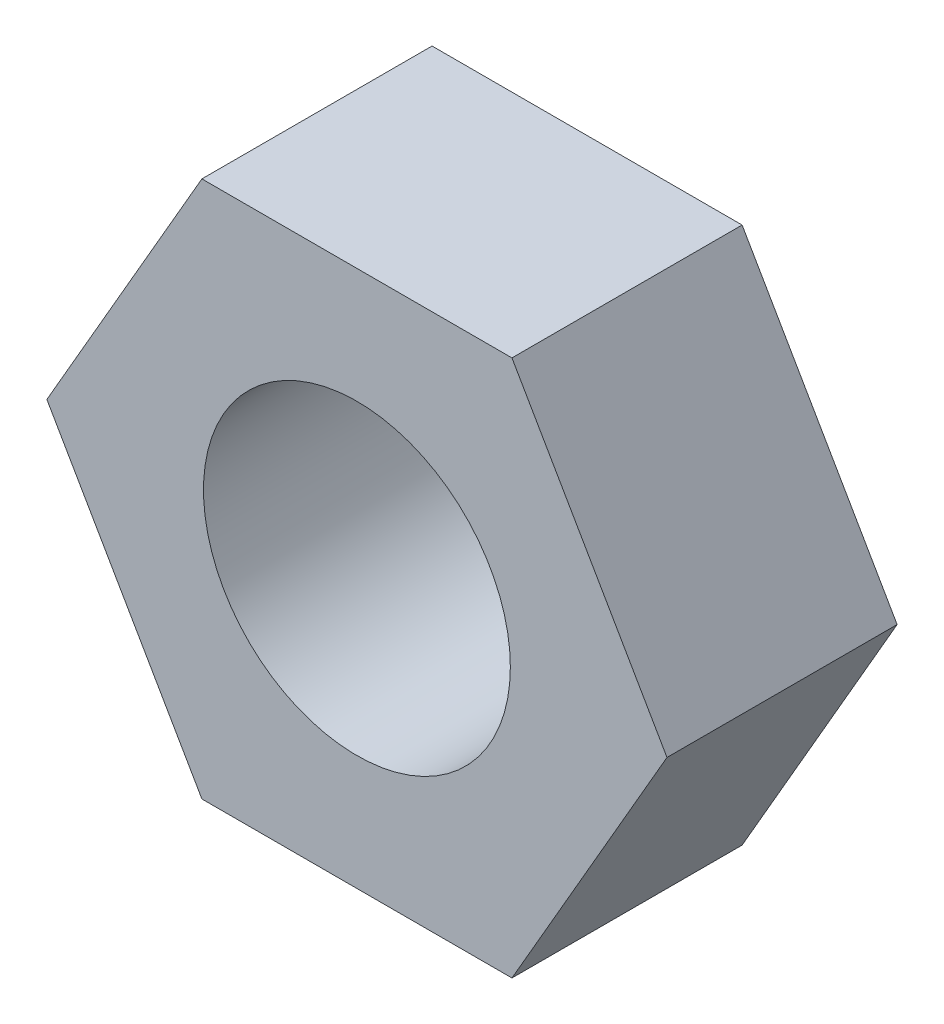
ISO-10303-21;
HEADER;
FILE_DESCRIPTION(('STEP AP214'),'2;1');
FILE_NAME('part.step','',(''),(''),'','','');
FILE_SCHEMA(('AUTOMOTIVE_DESIGN { 1 0 10303 214 1 1 1 1 }'));
ENDSEC;
DATA;
#1=APPLICATION_CONTEXT('core data for automotive mechanical design processes');
#2=APPLICATION_PROTOCOL_DEFINITION('international standard','automotive_design',2000,#1);
#3=PRODUCT_CONTEXT('',#1,'mechanical');
#4=PRODUCT('Part','Part','',(#3));
#5=PRODUCT_RELATED_PRODUCT_CATEGORY('part','',(#4));
#6=PRODUCT_DEFINITION_FORMATION('','',#4);
#7=PRODUCT_DEFINITION_CONTEXT('part definition',#1,'design');
#8=PRODUCT_DEFINITION('design','',#6,#7);
#9=PRODUCT_DEFINITION_SHAPE('','',#8);
#10=(LENGTH_UNIT() NAMED_UNIT(*) SI_UNIT(.MILLI.,.METRE.));
#11=(NAMED_UNIT(*) PLANE_ANGLE_UNIT() SI_UNIT($,.RADIAN.));
#12=(NAMED_UNIT(*) SI_UNIT($,.STERADIAN.) SOLID_ANGLE_UNIT());
#13=UNCERTAINTY_MEASURE_WITH_UNIT(LENGTH_MEASURE(1.E-05),#10,'distance_accuracy_value','');
#14=(GEOMETRIC_REPRESENTATION_CONTEXT(3) GLOBAL_UNCERTAINTY_ASSIGNED_CONTEXT((#13)) GLOBAL_UNIT_ASSIGNED_CONTEXT((#10,
#11,#12)) REPRESENTATION_CONTEXT('',''));
#15=CARTESIAN_POINT('',(0.,0.,0.));
#16=DIRECTION('',(0.,0.,1.));
#17=DIRECTION('',(1.,0.,0.));
#18=AXIS2_PLACEMENT_3D('',#15,#16,#17);
#19=CARTESIAN_POINT('',(0.,0.,3.));
#20=DIRECTION('',(0.,0.,1.));
#21=DIRECTION('',(1.,0.,0.));
#22=AXIS2_PLACEMENT_3D('',#19,#20,#21);
#23=PLANE('',#22);
#24=DIRECTION('',(-0.500000000000006,-0.866025403784435,0.));
#25=VECTOR('',#24,1.);
#26=CARTESIAN_POINT('',(-2.02072594216367,3.50000000000003,3.));
#27=LINE('',#26,#25);
#28=CARTESIAN_POINT('',(-2.02072594216367,3.50000000000003,3.));
#29=VERTEX_POINT('',#28);
#30=CARTESIAN_POINT('',(-4.04145188432739,0.,3.));
#31=VERTEX_POINT('',#30);
#32=EDGE_CURVE('E133',#29,#31,#27,.T.);
#33=ORIENTED_EDGE('',*,*,#32,.T.);
#34=DIRECTION('',(0.499999999999994,-0.866025403784442,0.));
#35=VECTOR('',#34,1.);
#36=CARTESIAN_POINT('',(-4.04145188432739,0.,3.));
#37=LINE('',#36,#35);
#38=CARTESIAN_POINT('',(-2.02072594216372,-3.5,3.));
#39=VERTEX_POINT('',#38);
#40=EDGE_CURVE('E91',#31,#39,#37,.T.);
#41=ORIENTED_EDGE('',*,*,#40,.T.);
#42=DIRECTION('',(1.,0.,0.));
#43=VECTOR('',#42,1.);
#44=CARTESIAN_POINT('',(-2.02072594216372,-3.5,3.));
#45=LINE('',#44,#43);
#46=CARTESIAN_POINT('',(2.02072594216367,-3.50000000000003,3.));
#47=VERTEX_POINT('',#46);
#48=EDGE_CURVE('E104',#39,#47,#45,.T.);
#49=ORIENTED_EDGE('',*,*,#48,.T.);
#50=DIRECTION('',(0.500000000000006,0.866025403784435,0.));
#51=VECTOR('',#50,1.);
#52=CARTESIAN_POINT('',(2.02072594216367,-3.50000000000003,3.));
#53=LINE('',#52,#51);
#54=CARTESIAN_POINT('',(4.0414518843274,0.,3.));
#55=VERTEX_POINT('',#54);
#56=EDGE_CURVE('E98',#47,#55,#53,.T.);
#57=ORIENTED_EDGE('',*,*,#56,.T.);
#58=DIRECTION('',(-0.499999999999994,0.866025403784442,0.));
#59=VECTOR('',#58,1.);
#60=CARTESIAN_POINT('',(4.0414518843274,0.,3.));
#61=LINE('',#60,#59);
#62=CARTESIAN_POINT('',(2.02072594216372,3.5,3.));
#63=VERTEX_POINT('',#62);
#64=EDGE_CURVE('E102',#55,#63,#61,.T.);
#65=ORIENTED_EDGE('',*,*,#64,.T.);
#66=DIRECTION('',(-1.,0.,0.));
#67=VECTOR('',#66,1.);
#68=CARTESIAN_POINT('',(2.02072594216372,3.5,3.));
#69=LINE('',#68,#67);
#70=EDGE_CURVE('E54',#63,#29,#69,.T.);
#71=ORIENTED_EDGE('',*,*,#70,.T.);
#72=EDGE_LOOP('',(#33,#41,#49,#57,#65,#71));
#73=FACE_BOUND('',#72,.T.);
#74=CARTESIAN_POINT('',(0.,0.,3.));
#75=DIRECTION('',(0.,0.,1.));
#76=DIRECTION('',(1.,0.,0.));
#77=AXIS2_PLACEMENT_3D('',#74,#75,#76);
#78=CIRCLE('',#77,2.);
#79=CARTESIAN_POINT('',(2.,0.,3.));
#80=VERTEX_POINT('',#79);
#81=EDGE_CURVE('E126',#80,#80,#78,.T.);
#82=ORIENTED_EDGE('',*,*,#81,.F.);
#83=EDGE_LOOP('',(#82));
#84=FACE_BOUND('',#83,.T.);
#85=ADVANCED_FACE('F37',(#73,#84),#23,.T.);
#86=CARTESIAN_POINT('',(0.,0.,0.));
#87=DIRECTION('',(0.,0.,1.));
#88=DIRECTION('',(1.,0.,0.));
#89=AXIS2_PLACEMENT_3D('',#86,#87,#88);
#90=PLANE('',#89);
#91=DIRECTION('',(-0.500000000000006,-0.866025403784435,0.));
#92=VECTOR('',#91,1.);
#93=CARTESIAN_POINT('',(-2.02072594216367,3.50000000000003,0.));
#94=LINE('',#93,#92);
#95=CARTESIAN_POINT('',(-2.02072594216367,3.50000000000003,0.));
#96=VERTEX_POINT('',#95);
#97=CARTESIAN_POINT('',(-4.04145188432739,0.,0.));
#98=VERTEX_POINT('',#97);
#99=EDGE_CURVE('E122',#96,#98,#94,.T.);
#100=ORIENTED_EDGE('',*,*,#99,.F.);
#101=DIRECTION('',(-1.,0.,0.));
#102=VECTOR('',#101,1.);
#103=CARTESIAN_POINT('',(2.02072594216372,3.5,0.));
#104=LINE('',#103,#102);
#105=CARTESIAN_POINT('',(2.02072594216372,3.5,0.));
#106=VERTEX_POINT('',#105);
#107=EDGE_CURVE('E83',#106,#96,#104,.T.);
#108=ORIENTED_EDGE('',*,*,#107,.F.);
#109=DIRECTION('',(-0.499999999999994,0.866025403784442,0.));
#110=VECTOR('',#109,1.);
#111=CARTESIAN_POINT('',(4.0414518843274,0.,0.));
#112=LINE('',#111,#110);
#113=CARTESIAN_POINT('',(4.0414518843274,0.,0.));
#114=VERTEX_POINT('',#113);
#115=EDGE_CURVE('E77',#114,#106,#112,.T.);
#116=ORIENTED_EDGE('',*,*,#115,.F.);
#117=DIRECTION('',(0.500000000000006,0.866025403784435,0.));
#118=VECTOR('',#117,1.);
#119=CARTESIAN_POINT('',(2.02072594216367,-3.50000000000003,0.));
#120=LINE('',#119,#118);
#121=CARTESIAN_POINT('',(2.02072594216367,-3.50000000000003,0.));
#122=VERTEX_POINT('',#121);
#123=EDGE_CURVE('E112',#122,#114,#120,.T.);
#124=ORIENTED_EDGE('',*,*,#123,.F.);
#125=DIRECTION('',(1.,0.,0.));
#126=VECTOR('',#125,1.);
#127=CARTESIAN_POINT('',(-2.02072594216372,-3.5,0.));
#128=LINE('',#127,#126);
#129=CARTESIAN_POINT('',(-2.02072594216372,-3.5,0.));
#130=VERTEX_POINT('',#129);
#131=EDGE_CURVE('E128',#130,#122,#128,.T.);
#132=ORIENTED_EDGE('',*,*,#131,.F.);
#133=DIRECTION('',(0.499999999999994,-0.866025403784442,0.));
#134=VECTOR('',#133,1.);
#135=CARTESIAN_POINT('',(-4.04145188432739,0.,0.));
#136=LINE('',#135,#134);
#137=EDGE_CURVE('E125',#98,#130,#136,.T.);
#138=ORIENTED_EDGE('',*,*,#137,.F.);
#139=EDGE_LOOP('',(#100,#108,#116,#124,#132,#138));
#140=FACE_BOUND('',#139,.T.);
#141=CARTESIAN_POINT('',(0.,0.,0.));
#142=DIRECTION('',(0.,0.,1.));
#143=DIRECTION('',(1.,0.,0.));
#144=AXIS2_PLACEMENT_3D('',#141,#142,#143);
#145=CIRCLE('',#144,2.);
#146=CARTESIAN_POINT('',(2.,0.,0.));
#147=VERTEX_POINT('',#146);
#148=EDGE_CURVE('E226',#147,#147,#145,.T.);
#149=ORIENTED_EDGE('',*,*,#148,.T.);
#150=EDGE_LOOP('',(#149));
#151=FACE_BOUND('',#150,.T.);
#152=ADVANCED_FACE('F142',(#140,#151),#90,.F.);
#153=CARTESIAN_POINT('',(-2.02072594216367,3.50000000000003,3.));
#154=DIRECTION('',(0.866025403784435,-0.500000000000006,0.));
#155=DIRECTION('',(0.500000000000006,0.866025403784435,0.));
#156=AXIS2_PLACEMENT_3D('',#153,#154,#155);
#157=PLANE('',#156);
#158=ORIENTED_EDGE('',*,*,#99,.T.);
#159=DIRECTION('',(0.,0.,-1.));
#160=VECTOR('',#159,1.);
#161=CARTESIAN_POINT('',(-4.04145188432739,0.,3.));
#162=LINE('',#161,#160);
#163=EDGE_CURVE('E11',#31,#98,#162,.T.);
#164=ORIENTED_EDGE('',*,*,#163,.F.);
#165=ORIENTED_EDGE('',*,*,#32,.F.);
#166=DIRECTION('',(0.,0.,-1.));
#167=VECTOR('',#166,1.);
#168=CARTESIAN_POINT('',(-2.02072594216367,3.50000000000003,3.));
#169=LINE('',#168,#167);
#170=EDGE_CURVE('E118',#29,#96,#169,.T.);
#171=ORIENTED_EDGE('',*,*,#170,.T.);
#172=EDGE_LOOP('',(#158,#164,#165,#171));
#173=FACE_BOUND('',#172,.T.);
#174=ADVANCED_FACE('F39',(#173),#157,.F.);
#175=CARTESIAN_POINT('',(-4.04145188432739,0.,3.));
#176=DIRECTION('',(0.866025403784442,0.499999999999994,0.));
#177=DIRECTION('',(-0.499999999999994,0.866025403784442,0.));
#178=AXIS2_PLACEMENT_3D('',#175,#176,#177);
#179=PLANE('',#178);
#180=ORIENTED_EDGE('',*,*,#137,.T.);
#181=DIRECTION('',(0.,0.,-1.));
#182=VECTOR('',#181,1.);
#183=CARTESIAN_POINT('',(-2.02072594216372,-3.5,3.));
#184=LINE('',#183,#182);
#185=EDGE_CURVE('E46',#39,#130,#184,.T.);
#186=ORIENTED_EDGE('',*,*,#185,.F.);
#187=ORIENTED_EDGE('',*,*,#40,.F.);
#188=ORIENTED_EDGE('',*,*,#163,.T.);
#189=EDGE_LOOP('',(#180,#186,#187,#188));
#190=FACE_BOUND('',#189,.T.);
#191=ADVANCED_FACE('F167',(#190),#179,.F.);
#192=CARTESIAN_POINT('',(-2.02072594216372,-3.5,3.));
#193=DIRECTION('',(0.,1.,0.));
#194=DIRECTION('',(-1.,0.,0.));
#195=AXIS2_PLACEMENT_3D('',#192,#193,#194);
#196=PLANE('',#195);
#197=ORIENTED_EDGE('',*,*,#131,.T.);
#198=DIRECTION('',(0.,0.,-1.));
#199=VECTOR('',#198,1.);
#200=CARTESIAN_POINT('',(2.02072594216367,-3.50000000000003,3.));
#201=LINE('',#200,#199);
#202=EDGE_CURVE('E113',#47,#122,#201,.T.);
#203=ORIENTED_EDGE('',*,*,#202,.F.);
#204=ORIENTED_EDGE('',*,*,#48,.F.);
#205=ORIENTED_EDGE('',*,*,#185,.T.);
#206=EDGE_LOOP('',(#197,#203,#204,#205));
#207=FACE_BOUND('',#206,.T.);
#208=ADVANCED_FACE('F139',(#207),#196,.F.);
#209=CARTESIAN_POINT('',(2.02072594216367,-3.50000000000003,3.));
#210=DIRECTION('',(-0.866025403784435,0.500000000000006,0.));
#211=DIRECTION('',(-0.500000000000006,-0.866025403784435,0.));
#212=AXIS2_PLACEMENT_3D('',#209,#210,#211);
#213=PLANE('',#212);
#214=ORIENTED_EDGE('',*,*,#123,.T.);
#215=DIRECTION('',(0.,0.,-1.));
#216=VECTOR('',#215,1.);
#217=CARTESIAN_POINT('',(4.0414518843274,0.,3.));
#218=LINE('',#217,#216);
#219=EDGE_CURVE('E109',#55,#114,#218,.T.);
#220=ORIENTED_EDGE('',*,*,#219,.F.);
#221=ORIENTED_EDGE('',*,*,#56,.F.);
#222=ORIENTED_EDGE('',*,*,#202,.T.);
#223=EDGE_LOOP('',(#214,#220,#221,#222));
#224=FACE_BOUND('',#223,.T.);
#225=ADVANCED_FACE('F110',(#224),#213,.F.);
#226=CARTESIAN_POINT('',(4.0414518843274,0.,3.));
#227=DIRECTION('',(-0.866025403784442,-0.499999999999994,0.));
#228=DIRECTION('',(0.499999999999994,-0.866025403784442,0.));
#229=AXIS2_PLACEMENT_3D('',#226,#227,#228);
#230=PLANE('',#229);
#231=ORIENTED_EDGE('',*,*,#115,.T.);
#232=DIRECTION('',(0.,0.,-1.));
#233=VECTOR('',#232,1.);
#234=CARTESIAN_POINT('',(2.02072594216372,3.5,3.));
#235=LINE('',#234,#233);
#236=EDGE_CURVE('E114',#63,#106,#235,.T.);
#237=ORIENTED_EDGE('',*,*,#236,.F.);
#238=ORIENTED_EDGE('',*,*,#64,.F.);
#239=ORIENTED_EDGE('',*,*,#219,.T.);
#240=EDGE_LOOP('',(#231,#237,#238,#239));
#241=FACE_BOUND('',#240,.T.);
#242=ADVANCED_FACE('F116',(#241),#230,.F.);
#243=CARTESIAN_POINT('',(2.02072594216372,3.5,3.));
#244=DIRECTION('',(0.,-1.,0.));
#245=DIRECTION('',(1.,0.,0.));
#246=AXIS2_PLACEMENT_3D('',#243,#244,#245);
#247=PLANE('',#246);
#248=ORIENTED_EDGE('',*,*,#107,.T.);
#249=ORIENTED_EDGE('',*,*,#170,.F.);
#250=ORIENTED_EDGE('',*,*,#70,.F.);
#251=ORIENTED_EDGE('',*,*,#236,.T.);
#252=EDGE_LOOP('',(#248,#249,#250,#251));
#253=FACE_BOUND('',#252,.T.);
#254=ADVANCED_FACE('F147',(#253),#247,.F.);
#255=CARTESIAN_POINT('',(0.,0.,3.));
#256=DIRECTION('',(0.,0.,-1.));
#257=DIRECTION('',(-1.,0.,0.));
#258=AXIS2_PLACEMENT_3D('',#255,#256,#257);
#259=CYLINDRICAL_SURFACE('',#258,2.);
#260=ORIENTED_EDGE('',*,*,#81,.T.);
#261=EDGE_LOOP('',(#260));
#262=FACE_BOUND('',#261,.T.);
#263=ORIENTED_EDGE('',*,*,#148,.F.);
#264=EDGE_LOOP('',(#263));
#265=FACE_BOUND('',#264,.T.);
#266=ADVANCED_FACE('F149',(#262,#265),#259,.F.);
#267=CLOSED_SHELL('',(#85,#152,#174,#191,#208,#225,#242,#254,#266));
#268=MANIFOLD_SOLID_BREP('B2',#267);
#269=ADVANCED_BREP_SHAPE_REPRESENTATION('',(#18,#268),#14);
#270=SHAPE_DEFINITION_REPRESENTATION(#9,#269);
ENDSEC;
END-ISO-10303-21;
